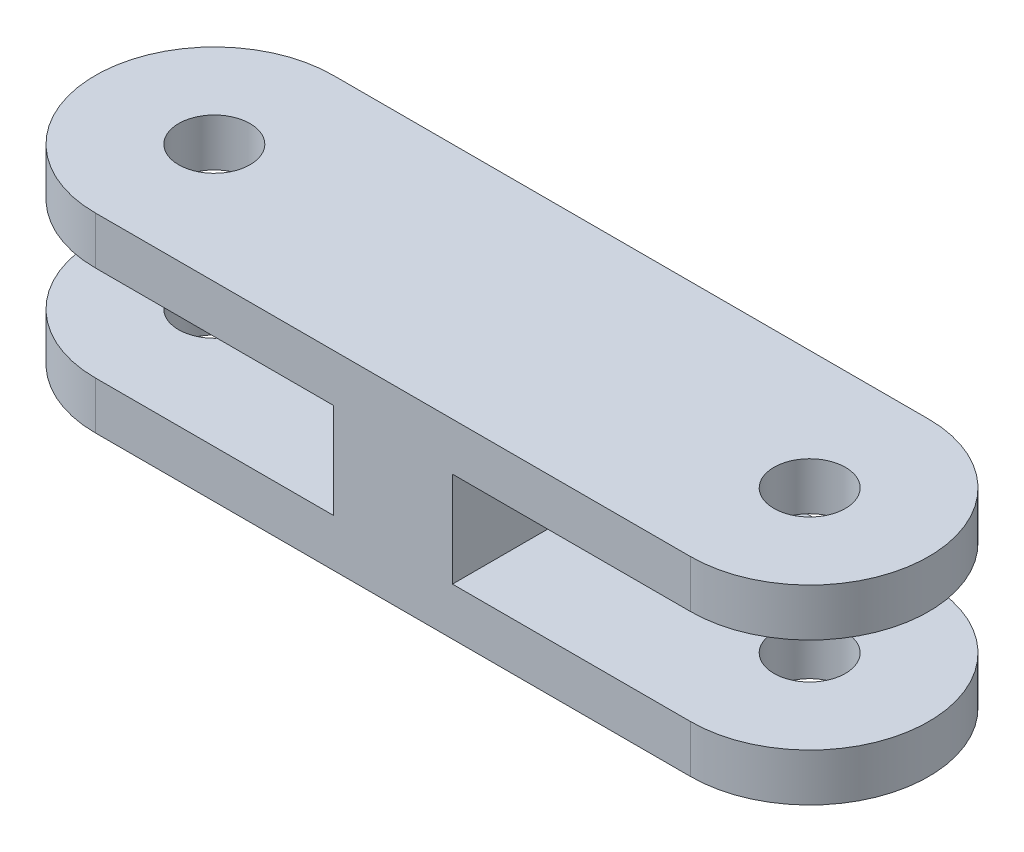
ISO-10303-21;
HEADER;
FILE_DESCRIPTION(('STEP AP214'),'2;1');
FILE_NAME('part.step','',(''),(''),'','','');
FILE_SCHEMA(('AUTOMOTIVE_DESIGN { 1 0 10303 214 1 1 1 1 }'));
ENDSEC;
DATA;
#1=APPLICATION_CONTEXT('core data for automotive mechanical design processes');
#2=APPLICATION_PROTOCOL_DEFINITION('international standard','automotive_design',2000,#1);
#3=PRODUCT_CONTEXT('',#1,'mechanical');
#4=PRODUCT('Part','Part','',(#3));
#5=PRODUCT_RELATED_PRODUCT_CATEGORY('part','',(#4));
#6=PRODUCT_DEFINITION_FORMATION('','',#4);
#7=PRODUCT_DEFINITION_CONTEXT('part definition',#1,'design');
#8=PRODUCT_DEFINITION('design','',#6,#7);
#9=PRODUCT_DEFINITION_SHAPE('','',#8);
#10=(LENGTH_UNIT() NAMED_UNIT(*) SI_UNIT(.MILLI.,.METRE.));
#11=(NAMED_UNIT(*) PLANE_ANGLE_UNIT() SI_UNIT($,.RADIAN.));
#12=(NAMED_UNIT(*) SI_UNIT($,.STERADIAN.) SOLID_ANGLE_UNIT());
#13=UNCERTAINTY_MEASURE_WITH_UNIT(LENGTH_MEASURE(1.E-05),#10,'distance_accuracy_value','');
#14=(GEOMETRIC_REPRESENTATION_CONTEXT(3) GLOBAL_UNCERTAINTY_ASSIGNED_CONTEXT((#13)) GLOBAL_UNIT_ASSIGNED_CONTEXT((#10,
#11,#12)) REPRESENTATION_CONTEXT('',''));
#15=CARTESIAN_POINT('',(0.,0.,0.));
#16=DIRECTION('',(0.,0.,1.));
#17=DIRECTION('',(1.,0.,0.));
#18=AXIS2_PLACEMENT_3D('',#15,#16,#17);
#19=CARTESIAN_POINT('',(-125.,80.,0.));
#20=DIRECTION('',(0.,-1.,0.));
#21=DIRECTION('',(0.,0.,-1.));
#22=AXIS2_PLACEMENT_3D('',#19,#20,#21);
#23=CYLINDRICAL_SURFACE('',#22,50.);
#24=DIRECTION('',(0.,-1.,0.));
#25=VECTOR('',#24,1.);
#26=CARTESIAN_POINT('',(-125.,80.,-50.));
#27=LINE('',#26,#25);
#28=CARTESIAN_POINT('',(-125.,80.,-50.));
#29=VERTEX_POINT('',#28);
#30=CARTESIAN_POINT('',(-125.,60.,-50.));
#31=VERTEX_POINT('',#30);
#32=EDGE_CURVE('E256',#29,#31,#27,.T.);
#33=ORIENTED_EDGE('',*,*,#32,.T.);
#34=CARTESIAN_POINT('',(-125.,60.,0.));
#35=DIRECTION('',(0.,1.,0.));
#36=DIRECTION('',(0.,0.,1.));
#37=AXIS2_PLACEMENT_3D('',#34,#35,#36);
#38=CIRCLE('',#37,50.);
#39=CARTESIAN_POINT('',(-125.,60.,50.));
#40=VERTEX_POINT('',#39);
#41=EDGE_CURVE('E207',#31,#40,#38,.T.);
#42=ORIENTED_EDGE('',*,*,#41,.T.);
#43=DIRECTION('',(0.,-1.,0.));
#44=VECTOR('',#43,1.);
#45=CARTESIAN_POINT('',(-125.,80.,50.));
#46=LINE('',#45,#44);
#47=CARTESIAN_POINT('',(-125.,80.,50.));
#48=VERTEX_POINT('',#47);
#49=EDGE_CURVE('E270',#48,#40,#46,.T.);
#50=ORIENTED_EDGE('',*,*,#49,.F.);
#51=CARTESIAN_POINT('',(-125.,80.,0.));
#52=DIRECTION('',(0.,1.,0.));
#53=DIRECTION('',(0.,0.,1.));
#54=AXIS2_PLACEMENT_3D('',#51,#52,#53);
#55=CIRCLE('',#54,50.);
#56=EDGE_CURVE('E228',#29,#48,#55,.T.);
#57=ORIENTED_EDGE('',*,*,#56,.F.);
#58=EDGE_LOOP('',(#33,#42,#50,#57));
#59=FACE_BOUND('',#58,.T.);
#60=ADVANCED_FACE('F45',(#59),#23,.T.);
#61=CARTESIAN_POINT('',(125.,80.,0.));
#62=DIRECTION('',(0.,-1.,0.));
#63=DIRECTION('',(0.,0.,-1.));
#64=AXIS2_PLACEMENT_3D('',#61,#62,#63);
#65=CYLINDRICAL_SURFACE('',#64,50.);
#66=DIRECTION('',(0.,-1.,0.));
#67=VECTOR('',#66,1.);
#68=CARTESIAN_POINT('',(125.,80.,50.));
#69=LINE('',#68,#67);
#70=CARTESIAN_POINT('',(125.,80.,50.));
#71=VERTEX_POINT('',#70);
#72=CARTESIAN_POINT('',(125.,60.,50.));
#73=VERTEX_POINT('',#72);
#74=EDGE_CURVE('E265',#71,#73,#69,.T.);
#75=ORIENTED_EDGE('',*,*,#74,.T.);
#76=CARTESIAN_POINT('',(125.,60.,0.));
#77=DIRECTION('',(0.,1.,0.));
#78=DIRECTION('',(0.,0.,1.));
#79=AXIS2_PLACEMENT_3D('',#76,#77,#78);
#80=CIRCLE('',#79,50.);
#81=CARTESIAN_POINT('',(125.,60.,-50.));
#82=VERTEX_POINT('',#81);
#83=EDGE_CURVE('E192',#73,#82,#80,.T.);
#84=ORIENTED_EDGE('',*,*,#83,.T.);
#85=DIRECTION('',(0.,-1.,0.));
#86=VECTOR('',#85,1.);
#87=CARTESIAN_POINT('',(125.,80.,-50.));
#88=LINE('',#87,#86);
#89=CARTESIAN_POINT('',(125.,80.,-50.));
#90=VERTEX_POINT('',#89);
#91=EDGE_CURVE('E260',#90,#82,#88,.T.);
#92=ORIENTED_EDGE('',*,*,#91,.F.);
#93=CARTESIAN_POINT('',(125.,80.,0.));
#94=DIRECTION('',(0.,1.,0.));
#95=DIRECTION('',(0.,0.,1.));
#96=AXIS2_PLACEMENT_3D('',#93,#94,#95);
#97=CIRCLE('',#96,50.);
#98=EDGE_CURVE('E236',#71,#90,#97,.T.);
#99=ORIENTED_EDGE('',*,*,#98,.F.);
#100=EDGE_LOOP('',(#75,#84,#92,#99));
#101=FACE_BOUND('',#100,.T.);
#102=ADVANCED_FACE('F341',(#101),#65,.T.);
#103=CARTESIAN_POINT('',(-125.,80.,0.));
#104=DIRECTION('',(0.,-1.,0.));
#105=DIRECTION('',(0.,0.,-1.));
#106=AXIS2_PLACEMENT_3D('',#103,#104,#105);
#107=CYLINDRICAL_SURFACE('',#106,15.);
#108=CARTESIAN_POINT('',(-125.,60.,0.));
#109=DIRECTION('',(0.,1.,0.));
#110=DIRECTION('',(0.,0.,1.));
#111=AXIS2_PLACEMENT_3D('',#108,#109,#110);
#112=CIRCLE('',#111,15.);
#113=CARTESIAN_POINT('',(-125.,60.,15.));
#114=VERTEX_POINT('',#113);
#115=EDGE_CURVE('E202',#114,#114,#112,.T.);
#116=ORIENTED_EDGE('',*,*,#115,.F.);
#117=EDGE_LOOP('',(#116));
#118=FACE_BOUND('',#117,.T.);
#119=CARTESIAN_POINT('',(-125.,80.,0.));
#120=DIRECTION('',(0.,1.,0.));
#121=DIRECTION('',(0.,0.,1.));
#122=AXIS2_PLACEMENT_3D('',#119,#120,#121);
#123=CIRCLE('',#122,15.);
#124=CARTESIAN_POINT('',(-125.,80.,15.));
#125=VERTEX_POINT('',#124);
#126=EDGE_CURVE('E220',#125,#125,#123,.T.);
#127=ORIENTED_EDGE('',*,*,#126,.T.);
#128=EDGE_LOOP('',(#127));
#129=FACE_BOUND('',#128,.T.);
#130=ADVANCED_FACE('F335',(#118,#129),#107,.F.);
#131=CARTESIAN_POINT('',(125.,80.,0.));
#132=DIRECTION('',(0.,-1.,0.));
#133=DIRECTION('',(0.,0.,-1.));
#134=AXIS2_PLACEMENT_3D('',#131,#132,#133);
#135=CYLINDRICAL_SURFACE('',#134,15.);
#136=CARTESIAN_POINT('',(125.,60.,0.));
#137=DIRECTION('',(0.,1.,0.));
#138=DIRECTION('',(0.,0.,1.));
#139=AXIS2_PLACEMENT_3D('',#136,#137,#138);
#140=CIRCLE('',#139,15.);
#141=CARTESIAN_POINT('',(125.,60.,15.));
#142=VERTEX_POINT('',#141);
#143=EDGE_CURVE('E187',#142,#142,#140,.T.);
#144=ORIENTED_EDGE('',*,*,#143,.F.);
#145=EDGE_LOOP('',(#144));
#146=FACE_BOUND('',#145,.T.);
#147=CARTESIAN_POINT('',(125.,80.,0.));
#148=DIRECTION('',(0.,1.,0.));
#149=DIRECTION('',(0.,0.,1.));
#150=AXIS2_PLACEMENT_3D('',#147,#148,#149);
#151=CIRCLE('',#150,15.);
#152=CARTESIAN_POINT('',(125.,80.,15.));
#153=VERTEX_POINT('',#152);
#154=EDGE_CURVE('E212',#153,#153,#151,.T.);
#155=ORIENTED_EDGE('',*,*,#154,.T.);
#156=EDGE_LOOP('',(#155));
#157=FACE_BOUND('',#156,.T.);
#158=ADVANCED_FACE('F328',(#146,#157),#135,.F.);
#159=CARTESIAN_POINT('',(-125.,80.,0.));
#160=DIRECTION('',(0.,1.,0.));
#161=DIRECTION('',(0.,0.,1.));
#162=AXIS2_PLACEMENT_3D('',#159,#160,#161);
#163=PLANE('',#162);
#164=ORIENTED_EDGE('',*,*,#126,.F.);
#165=EDGE_LOOP('',(#164));
#166=FACE_BOUND('',#165,.T.);
#167=ORIENTED_EDGE('',*,*,#56,.T.);
#168=DIRECTION('',(1.,0.,0.));
#169=VECTOR('',#168,1.);
#170=CARTESIAN_POINT('',(-125.,80.,50.));
#171=LINE('',#170,#169);
#172=EDGE_CURVE('E232',#48,#71,#171,.T.);
#173=ORIENTED_EDGE('',*,*,#172,.T.);
#174=ORIENTED_EDGE('',*,*,#98,.T.);
#175=DIRECTION('',(-1.,0.,0.));
#176=VECTOR('',#175,1.);
#177=CARTESIAN_POINT('',(-125.,80.,-50.));
#178=LINE('',#177,#176);
#179=EDGE_CURVE('E239',#90,#29,#178,.T.);
#180=ORIENTED_EDGE('',*,*,#179,.T.);
#181=EDGE_LOOP('',(#167,#173,#174,#180));
#182=FACE_BOUND('',#181,.T.);
#183=ORIENTED_EDGE('',*,*,#154,.F.);
#184=EDGE_LOOP('',(#183));
#185=FACE_BOUND('',#184,.T.);
#186=ADVANCED_FACE('F317',(#166,#182,#185),#163,.T.);
#187=CARTESIAN_POINT('',(-125.,0.,0.));
#188=DIRECTION('',(0.,1.,0.));
#189=DIRECTION('',(0.,0.,1.));
#190=AXIS2_PLACEMENT_3D('',#187,#188,#189);
#191=PLANE('',#190);
#192=CARTESIAN_POINT('',(-125.,0.,0.));
#193=DIRECTION('',(0.,1.,0.));
#194=DIRECTION('',(0.,0.,1.));
#195=AXIS2_PLACEMENT_3D('',#192,#193,#194);
#196=CIRCLE('',#195,50.);
#197=CARTESIAN_POINT('',(-125.,0.,-50.));
#198=VERTEX_POINT('',#197);
#199=CARTESIAN_POINT('',(-125.,0.,50.));
#200=VERTEX_POINT('',#199);
#201=EDGE_CURVE('E224',#198,#200,#196,.T.);
#202=ORIENTED_EDGE('',*,*,#201,.F.);
#203=DIRECTION('',(-1.,0.,0.));
#204=VECTOR('',#203,1.);
#205=CARTESIAN_POINT('',(-125.,0.,-50.));
#206=LINE('',#205,#204);
#207=CARTESIAN_POINT('',(125.,0.,-50.));
#208=VERTEX_POINT('',#207);
#209=EDGE_CURVE('E233',#208,#198,#206,.T.);
#210=ORIENTED_EDGE('',*,*,#209,.F.);
#211=CARTESIAN_POINT('',(125.,0.,0.));
#212=DIRECTION('',(0.,1.,0.));
#213=DIRECTION('',(0.,0.,1.));
#214=AXIS2_PLACEMENT_3D('',#211,#212,#213);
#215=CIRCLE('',#214,50.);
#216=CARTESIAN_POINT('',(125.,0.,50.));
#217=VERTEX_POINT('',#216);
#218=EDGE_CURVE('E250',#217,#208,#215,.T.);
#219=ORIENTED_EDGE('',*,*,#218,.F.);
#220=DIRECTION('',(1.,0.,0.));
#221=VECTOR('',#220,1.);
#222=CARTESIAN_POINT('',(-125.,0.,50.));
#223=LINE('',#222,#221);
#224=EDGE_CURVE('E246',#200,#217,#223,.T.);
#225=ORIENTED_EDGE('',*,*,#224,.F.);
#226=EDGE_LOOP('',(#202,#210,#219,#225));
#227=FACE_BOUND('',#226,.T.);
#228=CARTESIAN_POINT('',(-125.,0.,0.));
#229=DIRECTION('',(0.,1.,0.));
#230=DIRECTION('',(0.,0.,1.));
#231=AXIS2_PLACEMENT_3D('',#228,#229,#230);
#232=CIRCLE('',#231,15.);
#233=CARTESIAN_POINT('',(-125.,0.,15.));
#234=VERTEX_POINT('',#233);
#235=EDGE_CURVE('E216',#234,#234,#232,.T.);
#236=ORIENTED_EDGE('',*,*,#235,.T.);
#237=EDGE_LOOP('',(#236));
#238=FACE_BOUND('',#237,.T.);
#239=CARTESIAN_POINT('',(125.,0.,0.));
#240=DIRECTION('',(0.,1.,0.));
#241=DIRECTION('',(0.,0.,1.));
#242=AXIS2_PLACEMENT_3D('',#239,#240,#241);
#243=CIRCLE('',#242,15.);
#244=CARTESIAN_POINT('',(125.,0.,15.));
#245=VERTEX_POINT('',#244);
#246=EDGE_CURVE('E211',#245,#245,#243,.T.);
#247=ORIENTED_EDGE('',*,*,#246,.T.);
#248=EDGE_LOOP('',(#247));
#249=FACE_BOUND('',#248,.T.);
#250=ADVANCED_FACE('F313',(#227,#238,#249),#191,.F.);
#251=CARTESIAN_POINT('',(-125.,20.,50.));
#252=VERTEX_POINT('',#251);
#253=EDGE_CURVE('E269',#252,#200,#46,.T.);
#254=ORIENTED_EDGE('',*,*,#253,.F.);
#255=CARTESIAN_POINT('',(-125.,20.,0.));
#256=DIRECTION('',(0.,-1.,0.));
#257=DIRECTION('',(0.,0.,-1.));
#258=AXIS2_PLACEMENT_3D('',#255,#256,#257);
#259=CIRCLE('',#258,50.);
#260=CARTESIAN_POINT('',(-125.,20.,-50.));
#261=VERTEX_POINT('',#260);
#262=EDGE_CURVE('E148',#252,#261,#259,.T.);
#263=ORIENTED_EDGE('',*,*,#262,.T.);
#264=EDGE_CURVE('E242',#261,#198,#27,.T.);
#265=ORIENTED_EDGE('',*,*,#264,.T.);
#266=ORIENTED_EDGE('',*,*,#201,.T.);
#267=EDGE_LOOP('',(#254,#263,#265,#266));
#268=FACE_BOUND('',#267,.T.);
#269=ADVANCED_FACE('F47',(#268),#23,.T.);
#270=CARTESIAN_POINT('',(-125.,80.,50.));
#271=DIRECTION('',(0.,0.,-1.));
#272=DIRECTION('',(-1.,0.,0.));
#273=AXIS2_PLACEMENT_3D('',#270,#271,#272);
#274=PLANE('',#273);
#275=ORIENTED_EDGE('',*,*,#49,.T.);
#276=DIRECTION('',(-1.,0.,0.));
#277=VECTOR('',#276,1.);
#278=CARTESIAN_POINT('',(-225.,60.,50.));
#279=LINE('',#278,#277);
#280=CARTESIAN_POINT('',(-25.,60.,50.));
#281=VERTEX_POINT('',#280);
#282=EDGE_CURVE('E142',#281,#40,#279,.T.);
#283=ORIENTED_EDGE('',*,*,#282,.F.);
#284=DIRECTION('',(0.,1.,0.));
#285=VECTOR('',#284,1.);
#286=CARTESIAN_POINT('',(-25.,60.,50.));
#287=LINE('',#286,#285);
#288=CARTESIAN_POINT('',(-25.,20.,50.));
#289=VERTEX_POINT('',#288);
#290=EDGE_CURVE('E137',#289,#281,#287,.T.);
#291=ORIENTED_EDGE('',*,*,#290,.F.);
#292=DIRECTION('',(1.,0.,0.));
#293=VECTOR('',#292,1.);
#294=CARTESIAN_POINT('',(-225.,20.,50.));
#295=LINE('',#294,#293);
#296=EDGE_CURVE('E145',#252,#289,#295,.T.);
#297=ORIENTED_EDGE('',*,*,#296,.F.);
#298=ORIENTED_EDGE('',*,*,#253,.T.);
#299=ORIENTED_EDGE('',*,*,#224,.T.);
#300=CARTESIAN_POINT('',(125.,20.,50.));
#301=VERTEX_POINT('',#300);
#302=EDGE_CURVE('E264',#301,#217,#69,.T.);
#303=ORIENTED_EDGE('',*,*,#302,.F.);
#304=DIRECTION('',(1.,0.,0.));
#305=VECTOR('',#304,1.);
#306=CARTESIAN_POINT('',(25.,20.,50.));
#307=LINE('',#306,#305);
#308=CARTESIAN_POINT('',(25.,20.,50.));
#309=VERTEX_POINT('',#308);
#310=EDGE_CURVE('E176',#309,#301,#307,.T.);
#311=ORIENTED_EDGE('',*,*,#310,.F.);
#312=DIRECTION('',(0.,-1.,0.));
#313=VECTOR('',#312,1.);
#314=CARTESIAN_POINT('',(25.,60.,50.));
#315=LINE('',#314,#313);
#316=CARTESIAN_POINT('',(25.,60.,50.));
#317=VERTEX_POINT('',#316);
#318=EDGE_CURVE('E152',#317,#309,#315,.T.);
#319=ORIENTED_EDGE('',*,*,#318,.F.);
#320=DIRECTION('',(-1.,0.,0.));
#321=VECTOR('',#320,1.);
#322=CARTESIAN_POINT('',(25.,60.,50.));
#323=LINE('',#322,#321);
#324=EDGE_CURVE('E169',#73,#317,#323,.T.);
#325=ORIENTED_EDGE('',*,*,#324,.F.);
#326=ORIENTED_EDGE('',*,*,#74,.F.);
#327=ORIENTED_EDGE('',*,*,#172,.F.);
#328=EDGE_LOOP('',(#275,#283,#291,#297,#298,#299,#303,#311,#319,#325,#326,#327));
#329=FACE_BOUND('',#328,.T.);
#330=ADVANCED_FACE('F155',(#329),#274,.F.);
#331=CARTESIAN_POINT('',(125.,20.,-50.));
#332=VERTEX_POINT('',#331);
#333=EDGE_CURVE('E259',#332,#208,#88,.T.);
#334=ORIENTED_EDGE('',*,*,#333,.F.);
#335=CARTESIAN_POINT('',(125.,20.,0.));
#336=DIRECTION('',(0.,-1.,0.));
#337=DIRECTION('',(0.,0.,-1.));
#338=AXIS2_PLACEMENT_3D('',#335,#336,#337);
#339=CIRCLE('',#338,50.);
#340=EDGE_CURVE('E69',#332,#301,#339,.T.);
#341=ORIENTED_EDGE('',*,*,#340,.T.);
#342=ORIENTED_EDGE('',*,*,#302,.T.);
#343=ORIENTED_EDGE('',*,*,#218,.T.);
#344=EDGE_LOOP('',(#334,#341,#342,#343));
#345=FACE_BOUND('',#344,.T.);
#346=ADVANCED_FACE('F302',(#345),#65,.T.);
#347=CARTESIAN_POINT('',(-125.,80.,-50.));
#348=DIRECTION('',(0.,0.,1.));
#349=DIRECTION('',(1.,0.,0.));
#350=AXIS2_PLACEMENT_3D('',#347,#348,#349);
#351=PLANE('',#350);
#352=DIRECTION('',(0.,1.,0.));
#353=VECTOR('',#352,1.);
#354=CARTESIAN_POINT('',(-25.,80.,-50.));
#355=LINE('',#354,#353);
#356=CARTESIAN_POINT('',(-25.,20.,-50.));
#357=VERTEX_POINT('',#356);
#358=CARTESIAN_POINT('',(-25.,60.,-50.));
#359=VERTEX_POINT('',#358);
#360=EDGE_CURVE('E11',#357,#359,#355,.T.);
#361=ORIENTED_EDGE('',*,*,#360,.T.);
#362=DIRECTION('',(-1.,0.,0.));
#363=VECTOR('',#362,1.);
#364=CARTESIAN_POINT('',(-125.,60.,-50.));
#365=LINE('',#364,#363);
#366=EDGE_CURVE('E203',#359,#31,#365,.T.);
#367=ORIENTED_EDGE('',*,*,#366,.T.);
#368=ORIENTED_EDGE('',*,*,#32,.F.);
#369=ORIENTED_EDGE('',*,*,#179,.F.);
#370=ORIENTED_EDGE('',*,*,#91,.T.);
#371=DIRECTION('',(-1.,0.,0.));
#372=VECTOR('',#371,1.);
#373=CARTESIAN_POINT('',(-125.,60.,-50.));
#374=LINE('',#373,#372);
#375=CARTESIAN_POINT('',(25.,60.,-50.));
#376=VERTEX_POINT('',#375);
#377=EDGE_CURVE('E188',#82,#376,#374,.T.);
#378=ORIENTED_EDGE('',*,*,#377,.T.);
#379=DIRECTION('',(0.,-1.,0.));
#380=VECTOR('',#379,1.);
#381=CARTESIAN_POINT('',(25.,79.9999999999999,-50.));
#382=LINE('',#381,#380);
#383=CARTESIAN_POINT('',(25.,20.,-50.));
#384=VERTEX_POINT('',#383);
#385=EDGE_CURVE('E54',#376,#384,#382,.T.);
#386=ORIENTED_EDGE('',*,*,#385,.T.);
#387=DIRECTION('',(1.,0.,0.));
#388=VECTOR('',#387,1.);
#389=CARTESIAN_POINT('',(-125.,20.,-50.));
#390=LINE('',#389,#388);
#391=EDGE_CURVE('E182',#384,#332,#390,.T.);
#392=ORIENTED_EDGE('',*,*,#391,.T.);
#393=ORIENTED_EDGE('',*,*,#333,.T.);
#394=ORIENTED_EDGE('',*,*,#209,.T.);
#395=ORIENTED_EDGE('',*,*,#264,.F.);
#396=DIRECTION('',(1.,0.,0.));
#397=VECTOR('',#396,1.);
#398=CARTESIAN_POINT('',(-125.,20.,-50.));
#399=LINE('',#398,#397);
#400=EDGE_CURVE('E197',#261,#357,#399,.T.);
#401=ORIENTED_EDGE('',*,*,#400,.T.);
#402=EDGE_LOOP('',(#361,#367,#368,#369,#370,#378,#386,#392,#393,#394,#395,#401));
#403=FACE_BOUND('',#402,.T.);
#404=ADVANCED_FACE('F287',(#403),#351,.F.);
#405=CARTESIAN_POINT('',(-125.,20.,0.));
#406=DIRECTION('',(0.,-1.,0.));
#407=DIRECTION('',(0.,0.,-1.));
#408=AXIS2_PLACEMENT_3D('',#405,#406,#407);
#409=CIRCLE('',#408,15.);
#410=CARTESIAN_POINT('',(-125.,20.,-15.));
#411=VERTEX_POINT('',#410);
#412=EDGE_CURVE('E196',#411,#411,#409,.T.);
#413=ORIENTED_EDGE('',*,*,#412,.F.);
#414=EDGE_LOOP('',(#413));
#415=FACE_BOUND('',#414,.T.);
#416=ORIENTED_EDGE('',*,*,#235,.F.);
#417=EDGE_LOOP('',(#416));
#418=FACE_BOUND('',#417,.T.);
#419=ADVANCED_FACE('F325',(#415,#418),#107,.F.);
#420=CARTESIAN_POINT('',(125.,20.,0.));
#421=DIRECTION('',(0.,-1.,0.));
#422=DIRECTION('',(0.,0.,-1.));
#423=AXIS2_PLACEMENT_3D('',#420,#421,#422);
#424=CIRCLE('',#423,15.);
#425=CARTESIAN_POINT('',(125.,20.,-15.0000000000001));
#426=VERTEX_POINT('',#425);
#427=EDGE_CURVE('E164',#426,#426,#424,.T.);
#428=ORIENTED_EDGE('',*,*,#427,.F.);
#429=EDGE_LOOP('',(#428));
#430=FACE_BOUND('',#429,.T.);
#431=ORIENTED_EDGE('',*,*,#246,.F.);
#432=EDGE_LOOP('',(#431));
#433=FACE_BOUND('',#432,.T.);
#434=ADVANCED_FACE('F323',(#430,#433),#135,.F.);
#435=CARTESIAN_POINT('',(25.,60.,-75.));
#436=DIRECTION('',(-1.,0.,0.));
#437=DIRECTION('',(0.,-1.,0.));
#438=AXIS2_PLACEMENT_3D('',#435,#436,#437);
#439=PLANE('',#438);
#440=DIRECTION('',(0.,0.,1.));
#441=VECTOR('',#440,1.);
#442=CARTESIAN_POINT('',(25.,60.,-75.));
#443=LINE('',#442,#441);
#444=EDGE_CURVE('E170',#376,#317,#443,.T.);
#445=ORIENTED_EDGE('',*,*,#444,.T.);
#446=ORIENTED_EDGE('',*,*,#318,.T.);
#447=DIRECTION('',(0.,0.,1.));
#448=VECTOR('',#447,1.);
#449=CARTESIAN_POINT('',(25.,20.,-75.));
#450=LINE('',#449,#448);
#451=EDGE_CURVE('E166',#384,#309,#450,.T.);
#452=ORIENTED_EDGE('',*,*,#451,.F.);
#453=ORIENTED_EDGE('',*,*,#385,.F.);
#454=EDGE_LOOP('',(#445,#446,#452,#453));
#455=FACE_BOUND('',#454,.T.);
#456=ADVANCED_FACE('F292',(#455),#439,.F.);
#457=CARTESIAN_POINT('',(25.,60.,-75.));
#458=DIRECTION('',(0.,1.,0.));
#459=DIRECTION('',(0.,0.,1.));
#460=AXIS2_PLACEMENT_3D('',#457,#458,#459);
#461=PLANE('',#460);
#462=ORIENTED_EDGE('',*,*,#143,.T.);
#463=EDGE_LOOP('',(#462));
#464=FACE_BOUND('',#463,.T.);
#465=ORIENTED_EDGE('',*,*,#324,.T.);
#466=ORIENTED_EDGE('',*,*,#444,.F.);
#467=ORIENTED_EDGE('',*,*,#377,.F.);
#468=ORIENTED_EDGE('',*,*,#83,.F.);
#469=EDGE_LOOP('',(#465,#466,#467,#468));
#470=FACE_BOUND('',#469,.T.);
#471=ADVANCED_FACE('F294',(#464,#470),#461,.F.);
#472=CARTESIAN_POINT('',(25.,20.,-75.));
#473=DIRECTION('',(0.,-1.,0.));
#474=DIRECTION('',(0.,0.,-1.));
#475=AXIS2_PLACEMENT_3D('',#472,#473,#474);
#476=PLANE('',#475);
#477=ORIENTED_EDGE('',*,*,#427,.T.);
#478=EDGE_LOOP('',(#477));
#479=FACE_BOUND('',#478,.T.);
#480=ORIENTED_EDGE('',*,*,#391,.F.);
#481=ORIENTED_EDGE('',*,*,#451,.T.);
#482=ORIENTED_EDGE('',*,*,#310,.T.);
#483=ORIENTED_EDGE('',*,*,#340,.F.);
#484=EDGE_LOOP('',(#480,#481,#482,#483));
#485=FACE_BOUND('',#484,.T.);
#486=ADVANCED_FACE('F300',(#479,#485),#476,.F.);
#487=CARTESIAN_POINT('',(-25.,60.,-75.));
#488=DIRECTION('',(1.,0.,0.));
#489=DIRECTION('',(0.,0.,-1.));
#490=AXIS2_PLACEMENT_3D('',#487,#488,#489);
#491=PLANE('',#490);
#492=DIRECTION('',(0.,0.,1.));
#493=VECTOR('',#492,1.);
#494=CARTESIAN_POINT('',(-25.,20.,-75.));
#495=LINE('',#494,#493);
#496=EDGE_CURVE('E61',#357,#289,#495,.T.);
#497=ORIENTED_EDGE('',*,*,#496,.T.);
#498=ORIENTED_EDGE('',*,*,#290,.T.);
#499=DIRECTION('',(0.,0.,1.));
#500=VECTOR('',#499,1.);
#501=CARTESIAN_POINT('',(-25.,60.,-75.));
#502=LINE('',#501,#500);
#503=EDGE_CURVE('E141',#359,#281,#502,.T.);
#504=ORIENTED_EDGE('',*,*,#503,.F.);
#505=ORIENTED_EDGE('',*,*,#360,.F.);
#506=EDGE_LOOP('',(#497,#498,#504,#505));
#507=FACE_BOUND('',#506,.T.);
#508=ADVANCED_FACE('F134',(#507),#491,.F.);
#509=CARTESIAN_POINT('',(-225.,60.,-75.));
#510=DIRECTION('',(0.,1.,0.));
#511=DIRECTION('',(0.,0.,1.));
#512=AXIS2_PLACEMENT_3D('',#509,#510,#511);
#513=PLANE('',#512);
#514=ORIENTED_EDGE('',*,*,#115,.T.);
#515=EDGE_LOOP('',(#514));
#516=FACE_BOUND('',#515,.T.);
#517=ORIENTED_EDGE('',*,*,#366,.F.);
#518=ORIENTED_EDGE('',*,*,#503,.T.);
#519=ORIENTED_EDGE('',*,*,#282,.T.);
#520=ORIENTED_EDGE('',*,*,#41,.F.);
#521=EDGE_LOOP('',(#517,#518,#519,#520));
#522=FACE_BOUND('',#521,.T.);
#523=ADVANCED_FACE('F370',(#516,#522),#513,.F.);
#524=CARTESIAN_POINT('',(-225.,20.,-75.));
#525=DIRECTION('',(0.,-1.,0.));
#526=DIRECTION('',(0.,0.,-1.));
#527=AXIS2_PLACEMENT_3D('',#524,#525,#526);
#528=PLANE('',#527);
#529=ORIENTED_EDGE('',*,*,#412,.T.);
#530=EDGE_LOOP('',(#529));
#531=FACE_BOUND('',#530,.T.);
#532=ORIENTED_EDGE('',*,*,#296,.T.);
#533=ORIENTED_EDGE('',*,*,#496,.F.);
#534=ORIENTED_EDGE('',*,*,#400,.F.);
#535=ORIENTED_EDGE('',*,*,#262,.F.);
#536=EDGE_LOOP('',(#532,#533,#534,#535));
#537=FACE_BOUND('',#536,.T.);
#538=ADVANCED_FACE('F146',(#531,#537),#528,.F.);
#539=CLOSED_SHELL('',(#60,#102,#130,#158,#186,#250,#269,#330,#346,#404,#419,#434,#456,#471,#486,
#508,#523,#538));
#540=MANIFOLD_SOLID_BREP('B2',#539);
#541=ADVANCED_BREP_SHAPE_REPRESENTATION('',(#18,#540),#14);
#542=SHAPE_DEFINITION_REPRESENTATION(#9,#541);
ENDSEC;
END-ISO-10303-21;
